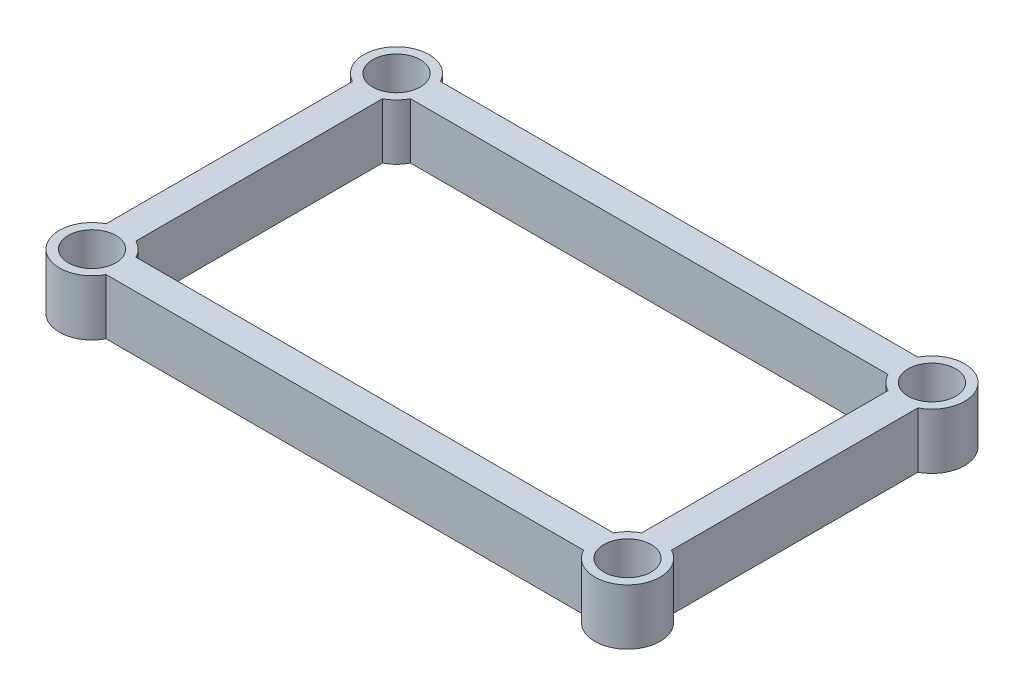
ISO-10303-21;
HEADER;
FILE_DESCRIPTION(('STEP AP214'),'2;1');
FILE_NAME('part.step','',(''),(''),'','','');
FILE_SCHEMA(('AUTOMOTIVE_DESIGN { 1 0 10303 214 1 1 1 1 }'));
ENDSEC;
DATA;
#1=APPLICATION_CONTEXT('core data for automotive mechanical design processes');
#2=APPLICATION_PROTOCOL_DEFINITION('international standard','automotive_design',2000,#1);
#3=PRODUCT_CONTEXT('',#1,'mechanical');
#4=PRODUCT('Part','Part','',(#3));
#5=PRODUCT_RELATED_PRODUCT_CATEGORY('part','',(#4));
#6=PRODUCT_DEFINITION_FORMATION('','',#4);
#7=PRODUCT_DEFINITION_CONTEXT('part definition',#1,'design');
#8=PRODUCT_DEFINITION('design','',#6,#7);
#9=PRODUCT_DEFINITION_SHAPE('','',#8);
#10=(LENGTH_UNIT() NAMED_UNIT(*) SI_UNIT(.MILLI.,.METRE.));
#11=(NAMED_UNIT(*) PLANE_ANGLE_UNIT() SI_UNIT($,.RADIAN.));
#12=(NAMED_UNIT(*) SI_UNIT($,.STERADIAN.) SOLID_ANGLE_UNIT());
#13=UNCERTAINTY_MEASURE_WITH_UNIT(LENGTH_MEASURE(1.E-05),#10,'distance_accuracy_value','');
#14=(GEOMETRIC_REPRESENTATION_CONTEXT(3) GLOBAL_UNCERTAINTY_ASSIGNED_CONTEXT((#13)) GLOBAL_UNIT_ASSIGNED_CONTEXT((#10,
#11,#12)) REPRESENTATION_CONTEXT('',''));
#15=CARTESIAN_POINT('',(0.,0.,0.));
#16=DIRECTION('',(0.,0.,1.));
#17=DIRECTION('',(1.,0.,0.));
#18=AXIS2_PLACEMENT_3D('',#15,#16,#17);
#19=CARTESIAN_POINT('',(-208.,20.5,-123.));
#20=DIRECTION('',(1.,0.,0.));
#21=DIRECTION('',(0.,0.,-1.));
#22=AXIS2_PLACEMENT_3D('',#19,#20,#21);
#23=PLANE('',#22);
#24=DIRECTION('',(0.,-1.,0.));
#25=VECTOR('',#24,1.);
#26=CARTESIAN_POINT('',(-208.,20.5,-90.6692709922984));
#27=LINE('',#26,#25);
#28=CARTESIAN_POINT('',(-208.,-20.5,-90.6692709922984));
#29=VERTEX_POINT('',#28);
#30=CARTESIAN_POINT('',(-208.,20.5,-90.6692709922984));
#31=VERTEX_POINT('',#30);
#32=EDGE_CURVE('E222',#29,#31,#27,.F.);
#33=ORIENTED_EDGE('',*,*,#32,.F.);
#34=DIRECTION('',(0.,0.,1.));
#35=VECTOR('',#34,1.);
#36=CARTESIAN_POINT('',(-208.,-20.5,-123.));
#37=LINE('',#36,#35);
#38=CARTESIAN_POINT('',(-208.,-20.5,90.6692709922984));
#39=VERTEX_POINT('',#38);
#40=EDGE_CURVE('E235',#29,#39,#37,.T.);
#41=ORIENTED_EDGE('',*,*,#40,.T.);
#42=DIRECTION('',(0.,-1.,0.));
#43=VECTOR('',#42,1.);
#44=CARTESIAN_POINT('',(-208.,20.5,90.6692709922984));
#45=LINE('',#44,#43);
#46=CARTESIAN_POINT('',(-208.,20.5,90.6692709922984));
#47=VERTEX_POINT('',#46);
#48=EDGE_CURVE('E196',#47,#39,#45,.T.);
#49=ORIENTED_EDGE('',*,*,#48,.F.);
#50=DIRECTION('',(0.,0.,1.));
#51=VECTOR('',#50,1.);
#52=CARTESIAN_POINT('',(-208.,20.5,-123.));
#53=LINE('',#52,#51);
#54=EDGE_CURVE('E231',#31,#47,#53,.T.);
#55=ORIENTED_EDGE('',*,*,#54,.F.);
#56=EDGE_LOOP('',(#33,#41,#49,#55));
#57=FACE_BOUND('',#56,.T.);
#58=ADVANCED_FACE('F43',(#57),#23,.F.);
#59=CARTESIAN_POINT('',(-208.,20.5,123.));
#60=DIRECTION('',(0.,0.,-1.));
#61=DIRECTION('',(-1.,0.,0.));
#62=AXIS2_PLACEMENT_3D('',#59,#60,#61);
#63=PLANE('',#62);
#64=DIRECTION('',(0.,-1.,0.));
#65=VECTOR('',#64,1.);
#66=CARTESIAN_POINT('',(175.669270992298,20.5,123.));
#67=LINE('',#66,#65);
#68=CARTESIAN_POINT('',(175.669270992298,20.5,123.));
#69=VERTEX_POINT('',#68);
#70=CARTESIAN_POINT('',(175.669270992298,-20.5,123.));
#71=VERTEX_POINT('',#70);
#72=EDGE_CURVE('E210',#69,#71,#67,.T.);
#73=ORIENTED_EDGE('',*,*,#72,.F.);
#74=DIRECTION('',(1.,0.,0.));
#75=VECTOR('',#74,1.);
#76=CARTESIAN_POINT('',(-208.,20.5,123.));
#77=LINE('',#76,#75);
#78=CARTESIAN_POINT('',(-175.669270992298,20.5,123.));
#79=VERTEX_POINT('',#78);
#80=EDGE_CURVE('E237',#79,#69,#77,.T.);
#81=ORIENTED_EDGE('',*,*,#80,.F.);
#82=DIRECTION('',(0.,-1.,0.));
#83=VECTOR('',#82,1.);
#84=CARTESIAN_POINT('',(-175.669270992298,20.5,123.));
#85=LINE('',#84,#83);
#86=CARTESIAN_POINT('',(-175.669270992298,-20.5,123.));
#87=VERTEX_POINT('',#86);
#88=EDGE_CURVE('E194',#87,#79,#85,.F.);
#89=ORIENTED_EDGE('',*,*,#88,.F.);
#90=DIRECTION('',(1.,0.,0.));
#91=VECTOR('',#90,1.);
#92=CARTESIAN_POINT('',(-208.,-20.5,123.));
#93=LINE('',#92,#91);
#94=EDGE_CURVE('E243',#87,#71,#93,.T.);
#95=ORIENTED_EDGE('',*,*,#94,.T.);
#96=EDGE_LOOP('',(#73,#81,#89,#95));
#97=FACE_BOUND('',#96,.T.);
#98=ADVANCED_FACE('F346',(#97),#63,.F.);
#99=CARTESIAN_POINT('',(208.,20.5,123.));
#100=DIRECTION('',(-1.,0.,0.));
#101=DIRECTION('',(0.,0.,1.));
#102=AXIS2_PLACEMENT_3D('',#99,#100,#101);
#103=PLANE('',#102);
#104=DIRECTION('',(0.,-1.,0.));
#105=VECTOR('',#104,1.);
#106=CARTESIAN_POINT('',(208.,20.5,90.6692709922984));
#107=LINE('',#106,#105);
#108=CARTESIAN_POINT('',(208.,-20.5,90.6692709922984));
#109=VERTEX_POINT('',#108);
#110=CARTESIAN_POINT('',(208.,20.5,90.6692709922984));
#111=VERTEX_POINT('',#110);
#112=EDGE_CURVE('E204',#109,#111,#107,.F.);
#113=ORIENTED_EDGE('',*,*,#112,.F.);
#114=DIRECTION('',(0.,0.,-1.));
#115=VECTOR('',#114,1.);
#116=CARTESIAN_POINT('',(208.,-20.5,123.));
#117=LINE('',#116,#115);
#118=CARTESIAN_POINT('',(208.,-20.5,-90.6692709922984));
#119=VERTEX_POINT('',#118);
#120=EDGE_CURVE('E248',#109,#119,#117,.T.);
#121=ORIENTED_EDGE('',*,*,#120,.T.);
#122=DIRECTION('',(0.,-1.,0.));
#123=VECTOR('',#122,1.);
#124=CARTESIAN_POINT('',(208.,20.5,-90.6692709922984));
#125=LINE('',#124,#123);
#126=CARTESIAN_POINT('',(208.,20.5,-90.6692709922984));
#127=VERTEX_POINT('',#126);
#128=EDGE_CURVE('E70',#127,#119,#125,.T.);
#129=ORIENTED_EDGE('',*,*,#128,.F.);
#130=DIRECTION('',(0.,0.,-1.));
#131=VECTOR('',#130,1.);
#132=CARTESIAN_POINT('',(208.,20.5,123.));
#133=LINE('',#132,#131);
#134=EDGE_CURVE('E238',#111,#127,#133,.T.);
#135=ORIENTED_EDGE('',*,*,#134,.F.);
#136=EDGE_LOOP('',(#113,#121,#129,#135));
#137=FACE_BOUND('',#136,.T.);
#138=ADVANCED_FACE('F335',(#137),#103,.F.);
#139=CARTESIAN_POINT('',(208.,20.5,-123.));
#140=DIRECTION('',(0.,0.,1.));
#141=DIRECTION('',(1.,0.,0.));
#142=AXIS2_PLACEMENT_3D('',#139,#140,#141);
#143=PLANE('',#142);
#144=DIRECTION('',(0.,-1.,0.));
#145=VECTOR('',#144,1.);
#146=CARTESIAN_POINT('',(-175.669270992298,20.5,-123.));
#147=LINE('',#146,#145);
#148=CARTESIAN_POINT('',(-175.669270992298,20.5,-123.));
#149=VERTEX_POINT('',#148);
#150=CARTESIAN_POINT('',(-175.669270992298,-20.5,-123.));
#151=VERTEX_POINT('',#150);
#152=EDGE_CURVE('E56',#149,#151,#147,.T.);
#153=ORIENTED_EDGE('',*,*,#152,.F.);
#154=DIRECTION('',(-1.,0.,0.));
#155=VECTOR('',#154,1.);
#156=CARTESIAN_POINT('',(208.,20.5,-123.));
#157=LINE('',#156,#155);
#158=CARTESIAN_POINT('',(175.669270992298,20.5,-123.));
#159=VERTEX_POINT('',#158);
#160=EDGE_CURVE('E169',#159,#149,#157,.T.);
#161=ORIENTED_EDGE('',*,*,#160,.F.);
#162=DIRECTION('',(0.,-1.,0.));
#163=VECTOR('',#162,1.);
#164=CARTESIAN_POINT('',(175.669270992298,20.5,-123.));
#165=LINE('',#164,#163);
#166=CARTESIAN_POINT('',(175.669270992298,-20.5,-123.));
#167=VERTEX_POINT('',#166);
#168=EDGE_CURVE('E213',#167,#159,#165,.F.);
#169=ORIENTED_EDGE('',*,*,#168,.F.);
#170=DIRECTION('',(-1.,0.,0.));
#171=VECTOR('',#170,1.);
#172=CARTESIAN_POINT('',(208.,-20.5,-123.));
#173=LINE('',#172,#171);
#174=EDGE_CURVE('E240',#167,#151,#173,.T.);
#175=ORIENTED_EDGE('',*,*,#174,.T.);
#176=EDGE_LOOP('',(#153,#161,#169,#175));
#177=FACE_BOUND('',#176,.T.);
#178=ADVANCED_FACE('F337',(#177),#143,.F.);
#179=CARTESIAN_POINT('',(-186.,-30.,-101.));
#180=DIRECTION('',(-1.,0.,0.));
#181=DIRECTION('',(0.,0.,1.));
#182=AXIS2_PLACEMENT_3D('',#179,#180,#181);
#183=PLANE('',#182);
#184=DIRECTION('',(0.,-1.,0.));
#185=VECTOR('',#184,1.);
#186=CARTESIAN_POINT('',(-186.,20.5,-90.6692709922985));
#187=LINE('',#186,#185);
#188=CARTESIAN_POINT('',(-186.,20.5,-90.6692709922985));
#189=VERTEX_POINT('',#188);
#190=CARTESIAN_POINT('',(-186.,-20.5,-90.6692709922985));
#191=VERTEX_POINT('',#190);
#192=EDGE_CURVE('E220',#189,#191,#187,.T.);
#193=ORIENTED_EDGE('',*,*,#192,.F.);
#194=DIRECTION('',(0.,0.,1.));
#195=VECTOR('',#194,1.);
#196=CARTESIAN_POINT('',(-186.,20.5,0.));
#197=LINE('',#196,#195);
#198=CARTESIAN_POINT('',(-186.,20.5,90.6692709922985));
#199=VERTEX_POINT('',#198);
#200=EDGE_CURVE('E230',#189,#199,#197,.T.);
#201=ORIENTED_EDGE('',*,*,#200,.T.);
#202=DIRECTION('',(0.,-1.,0.));
#203=VECTOR('',#202,1.);
#204=CARTESIAN_POINT('',(-186.,20.5,90.6692709922985));
#205=LINE('',#204,#203);
#206=CARTESIAN_POINT('',(-186.,-20.5,90.6692709922985));
#207=VERTEX_POINT('',#206);
#208=EDGE_CURVE('E191',#207,#199,#205,.F.);
#209=ORIENTED_EDGE('',*,*,#208,.F.);
#210=DIRECTION('',(0.,0.,1.));
#211=VECTOR('',#210,1.);
#212=CARTESIAN_POINT('',(-186.,-20.5,0.));
#213=LINE('',#212,#211);
#214=EDGE_CURVE('E176',#191,#207,#213,.T.);
#215=ORIENTED_EDGE('',*,*,#214,.F.);
#216=EDGE_LOOP('',(#193,#201,#209,#215));
#217=FACE_BOUND('',#216,.T.);
#218=ADVANCED_FACE('F338',(#217),#183,.F.);
#219=CARTESIAN_POINT('',(186.,-30.,-101.));
#220=DIRECTION('',(0.,0.,-1.));
#221=DIRECTION('',(-1.,0.,0.));
#222=AXIS2_PLACEMENT_3D('',#219,#220,#221);
#223=PLANE('',#222);
#224=DIRECTION('',(0.,-1.,0.));
#225=VECTOR('',#224,1.);
#226=CARTESIAN_POINT('',(-175.669270992298,20.5,-101.));
#227=LINE('',#226,#225);
#228=CARTESIAN_POINT('',(-175.669270992298,-20.5,-101.));
#229=VERTEX_POINT('',#228);
#230=CARTESIAN_POINT('',(-175.669270992298,20.5,-101.));
#231=VERTEX_POINT('',#230);
#232=EDGE_CURVE('E11',#229,#231,#227,.F.);
#233=ORIENTED_EDGE('',*,*,#232,.F.);
#234=DIRECTION('',(-1.,0.,0.));
#235=VECTOR('',#234,1.);
#236=CARTESIAN_POINT('',(0.,-20.5,-101.));
#237=LINE('',#236,#235);
#238=CARTESIAN_POINT('',(175.669270992298,-20.5,-101.));
#239=VERTEX_POINT('',#238);
#240=EDGE_CURVE('E253',#239,#229,#237,.T.);
#241=ORIENTED_EDGE('',*,*,#240,.F.);
#242=DIRECTION('',(0.,-1.,0.));
#243=VECTOR('',#242,1.);
#244=CARTESIAN_POINT('',(175.669270992298,20.5,-101.));
#245=LINE('',#244,#243);
#246=CARTESIAN_POINT('',(175.669270992298,20.5,-101.));
#247=VERTEX_POINT('',#246);
#248=EDGE_CURVE('E209',#247,#239,#245,.T.);
#249=ORIENTED_EDGE('',*,*,#248,.F.);
#250=DIRECTION('',(-1.,0.,0.));
#251=VECTOR('',#250,1.);
#252=CARTESIAN_POINT('',(0.,20.5,-101.));
#253=LINE('',#252,#251);
#254=EDGE_CURVE('E229',#247,#231,#253,.T.);
#255=ORIENTED_EDGE('',*,*,#254,.T.);
#256=EDGE_LOOP('',(#233,#241,#249,#255));
#257=FACE_BOUND('',#256,.T.);
#258=ADVANCED_FACE('F344',(#257),#223,.F.);
#259=CARTESIAN_POINT('',(186.,-30.,101.));
#260=DIRECTION('',(1.,0.,0.));
#261=DIRECTION('',(0.,0.,-1.));
#262=AXIS2_PLACEMENT_3D('',#259,#260,#261);
#263=PLANE('',#262);
#264=DIRECTION('',(0.,-1.,0.));
#265=VECTOR('',#264,1.);
#266=CARTESIAN_POINT('',(186.,20.5,90.6692709922985));
#267=LINE('',#266,#265);
#268=CARTESIAN_POINT('',(186.,20.5,90.6692709922985));
#269=VERTEX_POINT('',#268);
#270=CARTESIAN_POINT('',(186.,-20.5,90.6692709922985));
#271=VERTEX_POINT('',#270);
#272=EDGE_CURVE('E203',#269,#271,#267,.T.);
#273=ORIENTED_EDGE('',*,*,#272,.F.);
#274=DIRECTION('',(0.,0.,-1.));
#275=VECTOR('',#274,1.);
#276=CARTESIAN_POINT('',(186.,20.5,0.));
#277=LINE('',#276,#275);
#278=CARTESIAN_POINT('',(186.,20.5,-90.6692709922985));
#279=VERTEX_POINT('',#278);
#280=EDGE_CURVE('E226',#269,#279,#277,.T.);
#281=ORIENTED_EDGE('',*,*,#280,.T.);
#282=DIRECTION('',(0.,-1.,0.));
#283=VECTOR('',#282,1.);
#284=CARTESIAN_POINT('',(186.,20.5,-90.6692709922985));
#285=LINE('',#284,#283);
#286=CARTESIAN_POINT('',(186.,-20.5,-90.6692709922985));
#287=VERTEX_POINT('',#286);
#288=EDGE_CURVE('E51',#287,#279,#285,.F.);
#289=ORIENTED_EDGE('',*,*,#288,.F.);
#290=DIRECTION('',(0.,0.,-1.));
#291=VECTOR('',#290,1.);
#292=CARTESIAN_POINT('',(186.,-20.5,0.));
#293=LINE('',#292,#291);
#294=EDGE_CURVE('E170',#271,#287,#293,.T.);
#295=ORIENTED_EDGE('',*,*,#294,.F.);
#296=EDGE_LOOP('',(#273,#281,#289,#295));
#297=FACE_BOUND('',#296,.T.);
#298=ADVANCED_FACE('F385',(#297),#263,.F.);
#299=CARTESIAN_POINT('',(-186.,-30.,101.));
#300=DIRECTION('',(0.,0.,1.));
#301=DIRECTION('',(1.,0.,0.));
#302=AXIS2_PLACEMENT_3D('',#299,#300,#301);
#303=PLANE('',#302);
#304=DIRECTION('',(0.,-1.,0.));
#305=VECTOR('',#304,1.);
#306=CARTESIAN_POINT('',(175.669270992298,20.5,101.));
#307=LINE('',#306,#305);
#308=CARTESIAN_POINT('',(175.669270992298,-20.5,101.));
#309=VERTEX_POINT('',#308);
#310=CARTESIAN_POINT('',(175.669270992298,20.5,101.));
#311=VERTEX_POINT('',#310);
#312=EDGE_CURVE('E165',#309,#311,#307,.F.);
#313=ORIENTED_EDGE('',*,*,#312,.F.);
#314=DIRECTION('',(1.,0.,0.));
#315=VECTOR('',#314,1.);
#316=CARTESIAN_POINT('',(0.,-20.5,101.));
#317=LINE('',#316,#315);
#318=CARTESIAN_POINT('',(-175.669270992298,-20.5,101.));
#319=VERTEX_POINT('',#318);
#320=EDGE_CURVE('E156',#319,#309,#317,.T.);
#321=ORIENTED_EDGE('',*,*,#320,.F.);
#322=DIRECTION('',(0.,-1.,0.));
#323=VECTOR('',#322,1.);
#324=CARTESIAN_POINT('',(-175.669270992298,20.5,101.));
#325=LINE('',#324,#323);
#326=CARTESIAN_POINT('',(-175.669270992298,20.5,101.));
#327=VERTEX_POINT('',#326);
#328=EDGE_CURVE('E157',#327,#319,#325,.T.);
#329=ORIENTED_EDGE('',*,*,#328,.F.);
#330=DIRECTION('',(1.,0.,0.));
#331=VECTOR('',#330,1.);
#332=CARTESIAN_POINT('',(0.,20.5,101.));
#333=LINE('',#332,#331);
#334=EDGE_CURVE('E221',#327,#311,#333,.T.);
#335=ORIENTED_EDGE('',*,*,#334,.T.);
#336=EDGE_LOOP('',(#313,#321,#329,#335));
#337=FACE_BOUND('',#336,.T.);
#338=ADVANCED_FACE('F158',(#337),#303,.F.);
#339=CARTESIAN_POINT('',(0.,20.5,0.));
#340=DIRECTION('',(0.,1.,0.));
#341=DIRECTION('',(0.,0.,1.));
#342=AXIS2_PLACEMENT_3D('',#339,#340,#341);
#343=PLANE('',#342);
#344=CARTESIAN_POINT('',(-197.,20.5,-112.));
#345=DIRECTION('',(0.,1.,0.));
#346=DIRECTION('',(0.,0.,1.));
#347=AXIS2_PLACEMENT_3D('',#344,#345,#346);
#348=CIRCLE('',#347,17.5);
#349=CARTESIAN_POINT('',(-197.,20.5,-94.5));
#350=VERTEX_POINT('',#349);
#351=EDGE_CURVE('E280',#350,#350,#348,.T.);
#352=ORIENTED_EDGE('',*,*,#351,.F.);
#353=EDGE_LOOP('',(#352));
#354=FACE_BOUND('',#353,.T.);
#355=CARTESIAN_POINT('',(197.,20.5,112.));
#356=DIRECTION('',(0.,1.,0.));
#357=DIRECTION('',(0.,0.,1.));
#358=AXIS2_PLACEMENT_3D('',#355,#356,#357);
#359=CIRCLE('',#358,17.5);
#360=CARTESIAN_POINT('',(197.,20.5,129.5));
#361=VERTEX_POINT('',#360);
#362=EDGE_CURVE('E266',#361,#361,#359,.T.);
#363=ORIENTED_EDGE('',*,*,#362,.F.);
#364=EDGE_LOOP('',(#363));
#365=FACE_BOUND('',#364,.T.);
#366=CARTESIAN_POINT('',(197.,20.5,-112.));
#367=DIRECTION('',(0.,1.,0.));
#368=DIRECTION('',(0.,0.,1.));
#369=AXIS2_PLACEMENT_3D('',#366,#367,#368);
#370=CIRCLE('',#369,17.5);
#371=CARTESIAN_POINT('',(197.,20.5,-94.5));
#372=VERTEX_POINT('',#371);
#373=EDGE_CURVE('E263',#372,#372,#370,.T.);
#374=ORIENTED_EDGE('',*,*,#373,.F.);
#375=EDGE_LOOP('',(#374));
#376=FACE_BOUND('',#375,.T.);
#377=CARTESIAN_POINT('',(-197.,20.5,112.));
#378=DIRECTION('',(0.,1.,0.));
#379=DIRECTION('',(0.,0.,1.));
#380=AXIS2_PLACEMENT_3D('',#377,#378,#379);
#381=CIRCLE('',#380,17.5);
#382=CARTESIAN_POINT('',(-197.,20.5,129.5));
#383=VERTEX_POINT('',#382);
#384=EDGE_CURVE('E257',#383,#383,#381,.T.);
#385=ORIENTED_EDGE('',*,*,#384,.F.);
#386=EDGE_LOOP('',(#385));
#387=FACE_BOUND('',#386,.T.);
#388=ORIENTED_EDGE('',*,*,#200,.F.);
#389=CARTESIAN_POINT('',(-197.,20.5,-112.));
#390=DIRECTION('',(0.,1.,0.));
#391=DIRECTION('',(0.,0.,1.));
#392=AXIS2_PLACEMENT_3D('',#389,#390,#391);
#393=CIRCLE('',#392,24.);
#394=EDGE_CURVE('E295',#189,#231,#393,.T.);
#395=ORIENTED_EDGE('',*,*,#394,.T.);
#396=ORIENTED_EDGE('',*,*,#254,.F.);
#397=CARTESIAN_POINT('',(197.,20.5,-112.));
#398=DIRECTION('',(0.,1.,0.));
#399=DIRECTION('',(0.,0.,1.));
#400=AXIS2_PLACEMENT_3D('',#397,#398,#399);
#401=CIRCLE('',#400,24.);
#402=EDGE_CURVE('E278',#247,#279,#401,.T.);
#403=ORIENTED_EDGE('',*,*,#402,.T.);
#404=ORIENTED_EDGE('',*,*,#280,.F.);
#405=CARTESIAN_POINT('',(197.,20.5,112.));
#406=DIRECTION('',(0.,1.,0.));
#407=DIRECTION('',(0.,0.,1.));
#408=AXIS2_PLACEMENT_3D('',#405,#406,#407);
#409=CIRCLE('',#408,24.);
#410=EDGE_CURVE('E298',#269,#311,#409,.T.);
#411=ORIENTED_EDGE('',*,*,#410,.T.);
#412=ORIENTED_EDGE('',*,*,#334,.F.);
#413=CARTESIAN_POINT('',(-197.,20.5,112.));
#414=DIRECTION('',(0.,1.,0.));
#415=DIRECTION('',(0.,0.,1.));
#416=AXIS2_PLACEMENT_3D('',#413,#414,#415);
#417=CIRCLE('',#416,24.);
#418=EDGE_CURVE('E180',#327,#199,#417,.T.);
#419=ORIENTED_EDGE('',*,*,#418,.T.);
#420=EDGE_LOOP('',(#388,#395,#396,#403,#404,#411,#412,#419));
#421=FACE_BOUND('',#420,.T.);
#422=EDGE_CURVE('E293',#149,#31,#393,.T.);
#423=ORIENTED_EDGE('',*,*,#422,.T.);
#424=ORIENTED_EDGE('',*,*,#54,.T.);
#425=EDGE_CURVE('E184',#47,#79,#417,.T.);
#426=ORIENTED_EDGE('',*,*,#425,.T.);
#427=ORIENTED_EDGE('',*,*,#80,.T.);
#428=EDGE_CURVE('E283',#69,#111,#409,.T.);
#429=ORIENTED_EDGE('',*,*,#428,.T.);
#430=ORIENTED_EDGE('',*,*,#134,.T.);
#431=EDGE_CURVE('E288',#127,#159,#401,.T.);
#432=ORIENTED_EDGE('',*,*,#431,.T.);
#433=ORIENTED_EDGE('',*,*,#160,.T.);
#434=EDGE_LOOP('',(#423,#424,#426,#427,#429,#430,#432,#433));
#435=FACE_BOUND('',#434,.T.);
#436=ADVANCED_FACE('F306',(#354,#365,#376,#387,#421,#435),#343,.T.);
#437=CARTESIAN_POINT('',(0.,-20.5,0.));
#438=DIRECTION('',(0.,1.,0.));
#439=DIRECTION('',(0.,0.,1.));
#440=AXIS2_PLACEMENT_3D('',#437,#438,#439);
#441=PLANE('',#440);
#442=CARTESIAN_POINT('',(-197.,-20.5,-112.));
#443=DIRECTION('',(0.,1.,0.));
#444=DIRECTION('',(0.,0.,1.));
#445=AXIS2_PLACEMENT_3D('',#442,#443,#444);
#446=CIRCLE('',#445,17.5);
#447=CARTESIAN_POINT('',(-197.,-20.5,-94.5));
#448=VERTEX_POINT('',#447);
#449=EDGE_CURVE('E46',#448,#448,#446,.T.);
#450=ORIENTED_EDGE('',*,*,#449,.T.);
#451=EDGE_LOOP('',(#450));
#452=FACE_BOUND('',#451,.T.);
#453=CARTESIAN_POINT('',(197.,-20.5,112.));
#454=DIRECTION('',(0.,1.,0.));
#455=DIRECTION('',(0.,0.,1.));
#456=AXIS2_PLACEMENT_3D('',#453,#454,#455);
#457=CIRCLE('',#456,17.5);
#458=CARTESIAN_POINT('',(197.,-20.5,129.5));
#459=VERTEX_POINT('',#458);
#460=EDGE_CURVE('E262',#459,#459,#457,.T.);
#461=ORIENTED_EDGE('',*,*,#460,.T.);
#462=EDGE_LOOP('',(#461));
#463=FACE_BOUND('',#462,.T.);
#464=CARTESIAN_POINT('',(197.,-20.5,-112.));
#465=DIRECTION('',(0.,1.,0.));
#466=DIRECTION('',(0.,0.,1.));
#467=AXIS2_PLACEMENT_3D('',#464,#465,#466);
#468=CIRCLE('',#467,17.5);
#469=CARTESIAN_POINT('',(197.,-20.5,-94.5));
#470=VERTEX_POINT('',#469);
#471=EDGE_CURVE('E261',#470,#470,#468,.T.);
#472=ORIENTED_EDGE('',*,*,#471,.T.);
#473=EDGE_LOOP('',(#472));
#474=FACE_BOUND('',#473,.T.);
#475=CARTESIAN_POINT('',(-197.,-20.5,112.));
#476=DIRECTION('',(0.,1.,0.));
#477=DIRECTION('',(0.,0.,1.));
#478=AXIS2_PLACEMENT_3D('',#475,#476,#477);
#479=CIRCLE('',#478,17.5);
#480=CARTESIAN_POINT('',(-197.,-20.5,129.5));
#481=VERTEX_POINT('',#480);
#482=EDGE_CURVE('E260',#481,#481,#479,.T.);
#483=ORIENTED_EDGE('',*,*,#482,.T.);
#484=EDGE_LOOP('',(#483));
#485=FACE_BOUND('',#484,.T.);
#486=ORIENTED_EDGE('',*,*,#40,.F.);
#487=CARTESIAN_POINT('',(-197.,-20.5,-112.));
#488=DIRECTION('',(0.,1.,0.));
#489=DIRECTION('',(0.,0.,1.));
#490=AXIS2_PLACEMENT_3D('',#487,#488,#489);
#491=CIRCLE('',#490,24.);
#492=EDGE_CURVE('E292',#151,#29,#491,.T.);
#493=ORIENTED_EDGE('',*,*,#492,.F.);
#494=ORIENTED_EDGE('',*,*,#174,.F.);
#495=CARTESIAN_POINT('',(197.,-20.5,-112.));
#496=DIRECTION('',(0.,1.,0.));
#497=DIRECTION('',(0.,0.,1.));
#498=AXIS2_PLACEMENT_3D('',#495,#496,#497);
#499=CIRCLE('',#498,24.);
#500=EDGE_CURVE('E281',#119,#167,#499,.T.);
#501=ORIENTED_EDGE('',*,*,#500,.F.);
#502=ORIENTED_EDGE('',*,*,#120,.F.);
#503=CARTESIAN_POINT('',(197.,-20.5,112.));
#504=DIRECTION('',(0.,1.,0.));
#505=DIRECTION('',(0.,0.,1.));
#506=AXIS2_PLACEMENT_3D('',#503,#504,#505);
#507=CIRCLE('',#506,24.);
#508=EDGE_CURVE('E296',#71,#109,#507,.T.);
#509=ORIENTED_EDGE('',*,*,#508,.F.);
#510=ORIENTED_EDGE('',*,*,#94,.F.);
#511=CARTESIAN_POINT('',(-197.,-20.5,112.));
#512=DIRECTION('',(0.,1.,0.));
#513=DIRECTION('',(0.,0.,1.));
#514=AXIS2_PLACEMENT_3D('',#511,#512,#513);
#515=CIRCLE('',#514,24.);
#516=EDGE_CURVE('E183',#39,#87,#515,.T.);
#517=ORIENTED_EDGE('',*,*,#516,.F.);
#518=EDGE_LOOP('',(#486,#493,#494,#501,#502,#509,#510,#517));
#519=FACE_BOUND('',#518,.T.);
#520=ORIENTED_EDGE('',*,*,#240,.T.);
#521=EDGE_CURVE('E190',#191,#229,#491,.T.);
#522=ORIENTED_EDGE('',*,*,#521,.F.);
#523=ORIENTED_EDGE('',*,*,#214,.T.);
#524=EDGE_CURVE('E175',#319,#207,#515,.T.);
#525=ORIENTED_EDGE('',*,*,#524,.F.);
#526=ORIENTED_EDGE('',*,*,#320,.T.);
#527=EDGE_CURVE('E299',#271,#309,#507,.T.);
#528=ORIENTED_EDGE('',*,*,#527,.F.);
#529=ORIENTED_EDGE('',*,*,#294,.T.);
#530=EDGE_CURVE('E285',#239,#287,#499,.T.);
#531=ORIENTED_EDGE('',*,*,#530,.F.);
#532=EDGE_LOOP('',(#520,#522,#523,#525,#526,#528,#529,#531));
#533=FACE_BOUND('',#532,.T.);
#534=ADVANCED_FACE('F185',(#452,#463,#474,#485,#519,#533),#441,.F.);
#535=CARTESIAN_POINT('',(-197.,20.5,112.));
#536=DIRECTION('',(0.,-1.,0.));
#537=DIRECTION('',(0.,0.,-1.));
#538=AXIS2_PLACEMENT_3D('',#535,#536,#537);
#539=CYLINDRICAL_SURFACE('',#538,24.);
#540=ORIENTED_EDGE('',*,*,#524,.T.);
#541=ORIENTED_EDGE('',*,*,#208,.T.);
#542=ORIENTED_EDGE('',*,*,#418,.F.);
#543=ORIENTED_EDGE('',*,*,#328,.T.);
#544=EDGE_LOOP('',(#540,#541,#542,#543));
#545=FACE_BOUND('',#544,.T.);
#546=ADVANCED_FACE('F174',(#545),#539,.T.);
#547=CARTESIAN_POINT('',(197.,20.5,112.));
#548=DIRECTION('',(0.,-1.,0.));
#549=DIRECTION('',(0.,0.,-1.));
#550=AXIS2_PLACEMENT_3D('',#547,#548,#549);
#551=CYLINDRICAL_SURFACE('',#550,24.);
#552=ORIENTED_EDGE('',*,*,#410,.F.);
#553=ORIENTED_EDGE('',*,*,#272,.T.);
#554=ORIENTED_EDGE('',*,*,#527,.T.);
#555=ORIENTED_EDGE('',*,*,#312,.T.);
#556=EDGE_LOOP('',(#552,#553,#554,#555));
#557=FACE_BOUND('',#556,.T.);
#558=ADVANCED_FACE('F313',(#557),#551,.T.);
#559=CARTESIAN_POINT('',(197.,20.5,-112.));
#560=DIRECTION('',(0.,-1.,0.));
#561=DIRECTION('',(0.,0.,-1.));
#562=AXIS2_PLACEMENT_3D('',#559,#560,#561);
#563=CYLINDRICAL_SURFACE('',#562,24.);
#564=ORIENTED_EDGE('',*,*,#402,.F.);
#565=ORIENTED_EDGE('',*,*,#248,.T.);
#566=ORIENTED_EDGE('',*,*,#530,.T.);
#567=ORIENTED_EDGE('',*,*,#288,.T.);
#568=EDGE_LOOP('',(#564,#565,#566,#567));
#569=FACE_BOUND('',#568,.T.);
#570=ADVANCED_FACE('F449',(#569),#563,.T.);
#571=CARTESIAN_POINT('',(-197.,20.5,-112.));
#572=DIRECTION('',(0.,-1.,0.));
#573=DIRECTION('',(0.,0.,-1.));
#574=AXIS2_PLACEMENT_3D('',#571,#572,#573);
#575=CYLINDRICAL_SURFACE('',#574,24.);
#576=ORIENTED_EDGE('',*,*,#394,.F.);
#577=ORIENTED_EDGE('',*,*,#192,.T.);
#578=ORIENTED_EDGE('',*,*,#521,.T.);
#579=ORIENTED_EDGE('',*,*,#232,.T.);
#580=EDGE_LOOP('',(#576,#577,#578,#579));
#581=FACE_BOUND('',#580,.T.);
#582=ADVANCED_FACE('F457',(#581),#575,.T.);
#583=ORIENTED_EDGE('',*,*,#431,.F.);
#584=ORIENTED_EDGE('',*,*,#128,.T.);
#585=ORIENTED_EDGE('',*,*,#500,.T.);
#586=ORIENTED_EDGE('',*,*,#168,.T.);
#587=EDGE_LOOP('',(#583,#584,#585,#586));
#588=FACE_BOUND('',#587,.T.);
#589=ADVANCED_FACE('F336',(#588),#563,.T.);
#590=ORIENTED_EDGE('',*,*,#492,.T.);
#591=ORIENTED_EDGE('',*,*,#32,.T.);
#592=ORIENTED_EDGE('',*,*,#422,.F.);
#593=ORIENTED_EDGE('',*,*,#152,.T.);
#594=EDGE_LOOP('',(#590,#591,#592,#593));
#595=FACE_BOUND('',#594,.T.);
#596=ADVANCED_FACE('F320',(#595),#575,.T.);
#597=ORIENTED_EDGE('',*,*,#428,.F.);
#598=ORIENTED_EDGE('',*,*,#72,.T.);
#599=ORIENTED_EDGE('',*,*,#508,.T.);
#600=ORIENTED_EDGE('',*,*,#112,.T.);
#601=EDGE_LOOP('',(#597,#598,#599,#600));
#602=FACE_BOUND('',#601,.T.);
#603=ADVANCED_FACE('F329',(#602),#551,.T.);
#604=ORIENTED_EDGE('',*,*,#425,.F.);
#605=ORIENTED_EDGE('',*,*,#48,.T.);
#606=ORIENTED_EDGE('',*,*,#516,.T.);
#607=ORIENTED_EDGE('',*,*,#88,.T.);
#608=EDGE_LOOP('',(#604,#605,#606,#607));
#609=FACE_BOUND('',#608,.T.);
#610=ADVANCED_FACE('F330',(#609),#539,.T.);
#611=CARTESIAN_POINT('',(-197.,-30.,112.));
#612=DIRECTION('',(0.,1.,0.));
#613=DIRECTION('',(0.,0.,1.));
#614=AXIS2_PLACEMENT_3D('',#611,#612,#613);
#615=CYLINDRICAL_SURFACE('',#614,17.5);
#616=ORIENTED_EDGE('',*,*,#384,.T.);
#617=EDGE_LOOP('',(#616));
#618=FACE_BOUND('',#617,.T.);
#619=ORIENTED_EDGE('',*,*,#482,.F.);
#620=EDGE_LOOP('',(#619));
#621=FACE_BOUND('',#620,.T.);
#622=ADVANCED_FACE('F491',(#618,#621),#615,.F.);
#623=CARTESIAN_POINT('',(197.,-30.,-112.));
#624=DIRECTION('',(0.,1.,0.));
#625=DIRECTION('',(0.,0.,1.));
#626=AXIS2_PLACEMENT_3D('',#623,#624,#625);
#627=CYLINDRICAL_SURFACE('',#626,17.5);
#628=ORIENTED_EDGE('',*,*,#373,.T.);
#629=EDGE_LOOP('',(#628));
#630=FACE_BOUND('',#629,.T.);
#631=ORIENTED_EDGE('',*,*,#471,.F.);
#632=EDGE_LOOP('',(#631));
#633=FACE_BOUND('',#632,.T.);
#634=ADVANCED_FACE('F499',(#630,#633),#627,.F.);
#635=CARTESIAN_POINT('',(197.,-30.,112.));
#636=DIRECTION('',(0.,1.,0.));
#637=DIRECTION('',(0.,0.,1.));
#638=AXIS2_PLACEMENT_3D('',#635,#636,#637);
#639=CYLINDRICAL_SURFACE('',#638,17.5);
#640=ORIENTED_EDGE('',*,*,#362,.T.);
#641=EDGE_LOOP('',(#640));
#642=FACE_BOUND('',#641,.T.);
#643=ORIENTED_EDGE('',*,*,#460,.F.);
#644=EDGE_LOOP('',(#643));
#645=FACE_BOUND('',#644,.T.);
#646=ADVANCED_FACE('F510',(#642,#645),#639,.F.);
#647=CARTESIAN_POINT('',(-197.,-30.,-112.));
#648=DIRECTION('',(0.,1.,0.));
#649=DIRECTION('',(0.,0.,1.));
#650=AXIS2_PLACEMENT_3D('',#647,#648,#649);
#651=CYLINDRICAL_SURFACE('',#650,17.5);
#652=ORIENTED_EDGE('',*,*,#351,.T.);
#653=EDGE_LOOP('',(#652));
#654=FACE_BOUND('',#653,.T.);
#655=ORIENTED_EDGE('',*,*,#449,.F.);
#656=EDGE_LOOP('',(#655));
#657=FACE_BOUND('',#656,.T.);
#658=ADVANCED_FACE('F513',(#654,#657),#651,.F.);
#659=CLOSED_SHELL('',(#58,#98,#138,#178,#218,#258,#298,#338,#436,#534,#546,#558,#570,#582,#589,
#596,#603,#610,#622,#634,#646,#658));
#660=MANIFOLD_SOLID_BREP('B2',#659);
#661=ADVANCED_BREP_SHAPE_REPRESENTATION('',(#18,#660),#14);
#662=SHAPE_DEFINITION_REPRESENTATION(#9,#661);
ENDSEC;
END-ISO-10303-21;
